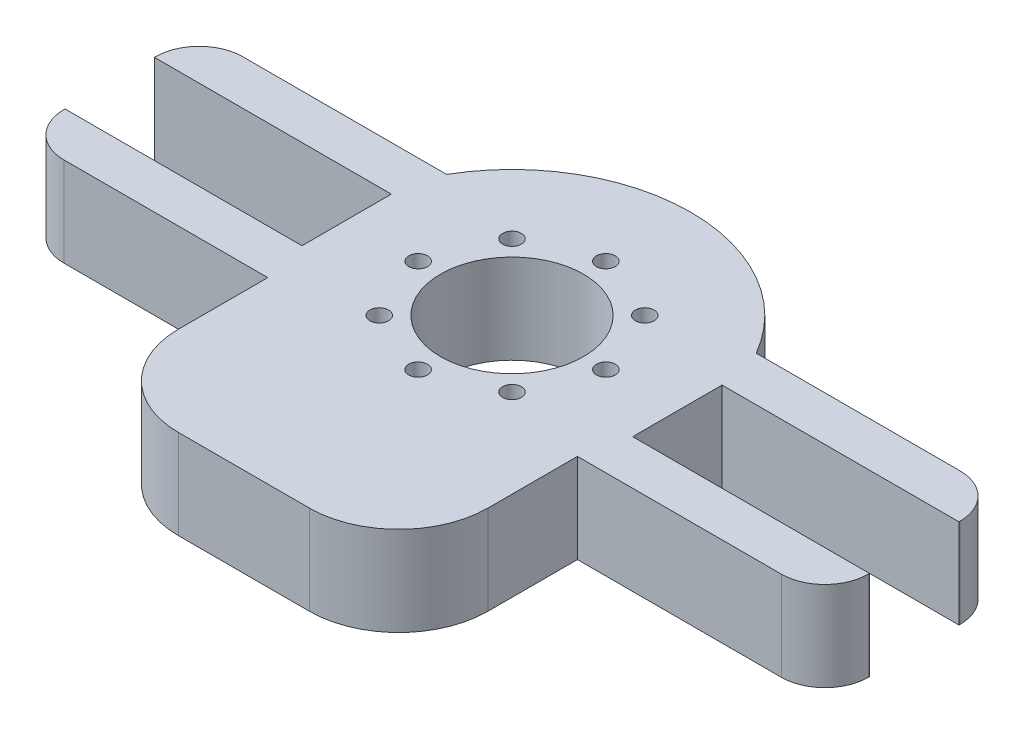
ISO-10303-21;
HEADER;
FILE_DESCRIPTION(('STEP AP214'),'2;1');
FILE_NAME('part.step','',(''),(''),'','','');
FILE_SCHEMA(('AUTOMOTIVE_DESIGN { 1 0 10303 214 1 1 1 1 }'));
ENDSEC;
DATA;
#1=APPLICATION_CONTEXT('core data for automotive mechanical design processes');
#2=APPLICATION_PROTOCOL_DEFINITION('international standard','automotive_design',2000,#1);
#3=PRODUCT_CONTEXT('',#1,'mechanical');
#4=PRODUCT('Part','Part','',(#3));
#5=PRODUCT_RELATED_PRODUCT_CATEGORY('part','',(#4));
#6=PRODUCT_DEFINITION_FORMATION('','',#4);
#7=PRODUCT_DEFINITION_CONTEXT('part definition',#1,'design');
#8=PRODUCT_DEFINITION('design','',#6,#7);
#9=PRODUCT_DEFINITION_SHAPE('','',#8);
#10=(LENGTH_UNIT() NAMED_UNIT(*) SI_UNIT(.MILLI.,.METRE.));
#11=(NAMED_UNIT(*) PLANE_ANGLE_UNIT() SI_UNIT($,.RADIAN.));
#12=(NAMED_UNIT(*) SI_UNIT($,.STERADIAN.) SOLID_ANGLE_UNIT());
#13=UNCERTAINTY_MEASURE_WITH_UNIT(LENGTH_MEASURE(1.E-05),#10,'distance_accuracy_value','');
#14=(GEOMETRIC_REPRESENTATION_CONTEXT(3) GLOBAL_UNCERTAINTY_ASSIGNED_CONTEXT((#13)) GLOBAL_UNIT_ASSIGNED_CONTEXT((#10,
#11,#12)) REPRESENTATION_CONTEXT('',''));
#15=CARTESIAN_POINT('',(0.,0.,0.));
#16=DIRECTION('',(0.,0.,1.));
#17=DIRECTION('',(1.,0.,0.));
#18=AXIS2_PLACEMENT_3D('',#15,#16,#17);
#19=CARTESIAN_POINT('',(-90.,20.,-20.));
#20=DIRECTION('',(-1.,0.,0.));
#21=DIRECTION('',(0.,0.,1.));
#22=AXIS2_PLACEMENT_3D('',#19,#20,#21);
#23=PLANE('',#22);
#24=DIRECTION('',(0.,0.,-1.));
#25=VECTOR('',#24,1.);
#26=CARTESIAN_POINT('',(-90.,20.,-20.));
#27=LINE('',#26,#25);
#28=CARTESIAN_POINT('',(-90.,20.,-10.));
#29=VERTEX_POINT('',#28);
#30=CARTESIAN_POINT('',(-90.,20.,-10.25));
#31=VERTEX_POINT('',#30);
#32=EDGE_CURVE('E236',#29,#31,#27,.T.);
#33=ORIENTED_EDGE('',*,*,#32,.T.);
#34=DIRECTION('',(0.,-1.,0.));
#35=VECTOR('',#34,1.);
#36=CARTESIAN_POINT('',(-90.,20.,-10.25));
#37=LINE('',#36,#35);
#38=CARTESIAN_POINT('',(-90.,0.,-10.25));
#39=VERTEX_POINT('',#38);
#40=EDGE_CURVE('E428',#31,#39,#37,.T.);
#41=ORIENTED_EDGE('',*,*,#40,.T.);
#42=DIRECTION('',(0.,0.,-1.));
#43=VECTOR('',#42,1.);
#44=CARTESIAN_POINT('',(-90.,0.,-20.));
#45=LINE('',#44,#43);
#46=CARTESIAN_POINT('',(-90.,0.,-10.));
#47=VERTEX_POINT('',#46);
#48=EDGE_CURVE('E272',#47,#39,#45,.T.);
#49=ORIENTED_EDGE('',*,*,#48,.F.);
#50=DIRECTION('',(0.,1.,0.));
#51=VECTOR('',#50,1.);
#52=CARTESIAN_POINT('',(-90.,-56.6480361530742,-10.));
#53=LINE('',#52,#51);
#54=EDGE_CURVE('E219',#47,#29,#53,.T.);
#55=ORIENTED_EDGE('',*,*,#54,.T.);
#56=EDGE_LOOP('',(#33,#41,#49,#55));
#57=FACE_BOUND('',#56,.T.);
#58=ADVANCED_FACE('F45',(#57),#23,.T.);
#59=CARTESIAN_POINT('',(-90.,0.,10.25));
#60=VERTEX_POINT('',#59);
#61=CARTESIAN_POINT('',(-90.,0.,10.));
#62=VERTEX_POINT('',#61);
#63=EDGE_CURVE('E274',#60,#62,#45,.T.);
#64=ORIENTED_EDGE('',*,*,#63,.F.);
#65=DIRECTION('',(0.,-1.,0.));
#66=VECTOR('',#65,1.);
#67=CARTESIAN_POINT('',(-90.,20.,10.25));
#68=LINE('',#67,#66);
#69=CARTESIAN_POINT('',(-90.,20.,10.25));
#70=VERTEX_POINT('',#69);
#71=EDGE_CURVE('E419',#60,#70,#68,.F.);
#72=ORIENTED_EDGE('',*,*,#71,.T.);
#73=CARTESIAN_POINT('',(-90.,20.,10.));
#74=VERTEX_POINT('',#73);
#75=EDGE_CURVE('E258',#70,#74,#27,.T.);
#76=ORIENTED_EDGE('',*,*,#75,.T.);
#77=DIRECTION('',(0.,1.,0.));
#78=VECTOR('',#77,1.);
#79=CARTESIAN_POINT('',(-90.,-56.6480361530742,10.));
#80=LINE('',#79,#78);
#81=EDGE_CURVE('E245',#62,#74,#80,.T.);
#82=ORIENTED_EDGE('',*,*,#81,.F.);
#83=EDGE_LOOP('',(#64,#72,#76,#82));
#84=FACE_BOUND('',#83,.T.);
#85=ADVANCED_FACE('F478',(#84),#23,.T.);
#86=CARTESIAN_POINT('',(90.,20.,-20.));
#87=DIRECTION('',(-1.,0.,0.));
#88=DIRECTION('',(0.,0.,1.));
#89=AXIS2_PLACEMENT_3D('',#86,#87,#88);
#90=PLANE('',#89);
#91=DIRECTION('',(0.,0.,-1.));
#92=VECTOR('',#91,1.);
#93=CARTESIAN_POINT('',(90.,0.,-20.));
#94=LINE('',#93,#92);
#95=CARTESIAN_POINT('',(90.,0.,-10.));
#96=VERTEX_POINT('',#95);
#97=CARTESIAN_POINT('',(90.,0.,-10.25));
#98=VERTEX_POINT('',#97);
#99=EDGE_CURVE('E370',#96,#98,#94,.T.);
#100=ORIENTED_EDGE('',*,*,#99,.T.);
#101=DIRECTION('',(0.,-1.,0.));
#102=VECTOR('',#101,1.);
#103=CARTESIAN_POINT('',(90.,20.,-10.25));
#104=LINE('',#103,#102);
#105=CARTESIAN_POINT('',(90.,20.,-10.25));
#106=VERTEX_POINT('',#105);
#107=EDGE_CURVE('E406',#98,#106,#104,.F.);
#108=ORIENTED_EDGE('',*,*,#107,.T.);
#109=DIRECTION('',(0.,0.,-1.));
#110=VECTOR('',#109,1.);
#111=CARTESIAN_POINT('',(90.,20.,-20.));
#112=LINE('',#111,#110);
#113=CARTESIAN_POINT('',(90.,20.,-10.));
#114=VERTEX_POINT('',#113);
#115=EDGE_CURVE('E348',#114,#106,#112,.T.);
#116=ORIENTED_EDGE('',*,*,#115,.F.);
#117=DIRECTION('',(0.,1.,0.));
#118=VECTOR('',#117,1.);
#119=CARTESIAN_POINT('',(90.,-56.6480361530742,-10.));
#120=LINE('',#119,#118);
#121=EDGE_CURVE('E315',#96,#114,#120,.T.);
#122=ORIENTED_EDGE('',*,*,#121,.F.);
#123=EDGE_LOOP('',(#100,#108,#116,#122));
#124=FACE_BOUND('',#123,.T.);
#125=ADVANCED_FACE('F595',(#124),#90,.F.);
#126=CARTESIAN_POINT('',(0.,20.,0.));
#127=DIRECTION('',(0.,-1.,0.));
#128=DIRECTION('',(0.,0.,-1.));
#129=AXIS2_PLACEMENT_3D('',#126,#127,#128);
#130=CYLINDRICAL_SURFACE('',#129,40.);
#131=CARTESIAN_POINT('',(0.,0.,0.));
#132=DIRECTION('',(0.,1.,0.));
#133=DIRECTION('',(0.,0.,1.));
#134=AXIS2_PLACEMENT_3D('',#131,#132,#133);
#135=CIRCLE('',#134,40.);
#136=CARTESIAN_POINT('',(34.6410161513776,0.,-20.));
#137=VERTEX_POINT('',#136);
#138=CARTESIAN_POINT('',(-34.6410161513776,0.,-20.));
#139=VERTEX_POINT('',#138);
#140=EDGE_CURVE('E326',#137,#139,#135,.T.);
#141=ORIENTED_EDGE('',*,*,#140,.T.);
#142=DIRECTION('',(0.,-1.,0.));
#143=VECTOR('',#142,1.);
#144=CARTESIAN_POINT('',(-34.6410161513776,20.,-20.));
#145=LINE('',#144,#143);
#146=CARTESIAN_POINT('',(-34.6410161513776,20.,-20.));
#147=VERTEX_POINT('',#146);
#148=EDGE_CURVE('E286',#147,#139,#145,.T.);
#149=ORIENTED_EDGE('',*,*,#148,.F.);
#150=CARTESIAN_POINT('',(0.,20.,0.));
#151=DIRECTION('',(0.,1.,0.));
#152=DIRECTION('',(0.,0.,1.));
#153=AXIS2_PLACEMENT_3D('',#150,#151,#152);
#154=CIRCLE('',#153,40.);
#155=CARTESIAN_POINT('',(34.6410161513776,20.,-20.));
#156=VERTEX_POINT('',#155);
#157=EDGE_CURVE('E333',#156,#147,#154,.T.);
#158=ORIENTED_EDGE('',*,*,#157,.F.);
#159=DIRECTION('',(0.,-1.,0.));
#160=VECTOR('',#159,1.);
#161=CARTESIAN_POINT('',(34.6410161513776,20.,-20.));
#162=LINE('',#161,#160);
#163=EDGE_CURVE('E355',#156,#137,#162,.T.);
#164=ORIENTED_EDGE('',*,*,#163,.T.);
#165=EDGE_LOOP('',(#141,#149,#158,#164));
#166=FACE_BOUND('',#165,.T.);
#167=ADVANCED_FACE('F641',(#166),#130,.T.);
#168=CARTESIAN_POINT('',(34.6410161513775,20.,60.));
#169=DIRECTION('',(0.,0.,-1.));
#170=DIRECTION('',(-1.,0.,0.));
#171=AXIS2_PLACEMENT_3D('',#168,#169,#170);
#172=PLANE('',#171);
#173=DIRECTION('',(1.,0.,0.));
#174=VECTOR('',#173,1.);
#175=CARTESIAN_POINT('',(34.6410161513775,20.,60.));
#176=LINE('',#175,#174);
#177=CARTESIAN_POINT('',(-14.6410161513775,20.,60.));
#178=VERTEX_POINT('',#177);
#179=CARTESIAN_POINT('',(14.6410161513775,20.,60.));
#180=VERTEX_POINT('',#179);
#181=EDGE_CURVE('E337',#178,#180,#176,.T.);
#182=ORIENTED_EDGE('',*,*,#181,.F.);
#183=DIRECTION('',(0.,-1.,0.));
#184=VECTOR('',#183,1.);
#185=CARTESIAN_POINT('',(-14.6410161513775,0.,60.));
#186=LINE('',#185,#184);
#187=CARTESIAN_POINT('',(-14.6410161513775,0.,60.));
#188=VERTEX_POINT('',#187);
#189=EDGE_CURVE('E438',#178,#188,#186,.T.);
#190=ORIENTED_EDGE('',*,*,#189,.T.);
#191=DIRECTION('',(1.,0.,0.));
#192=VECTOR('',#191,1.);
#193=CARTESIAN_POINT('',(34.6410161513775,0.,60.));
#194=LINE('',#193,#192);
#195=CARTESIAN_POINT('',(14.6410161513775,0.,60.));
#196=VERTEX_POINT('',#195);
#197=EDGE_CURVE('E359',#188,#196,#194,.T.);
#198=ORIENTED_EDGE('',*,*,#197,.T.);
#199=DIRECTION('',(0.,-1.,0.));
#200=VECTOR('',#199,1.);
#201=CARTESIAN_POINT('',(14.6410161513775,20.,60.));
#202=LINE('',#201,#200);
#203=EDGE_CURVE('E435',#196,#180,#202,.F.);
#204=ORIENTED_EDGE('',*,*,#203,.T.);
#205=EDGE_LOOP('',(#182,#190,#198,#204));
#206=FACE_BOUND('',#205,.T.);
#207=ADVANCED_FACE('F458',(#206),#172,.F.);
#208=CARTESIAN_POINT('',(34.6410161513775,20.,20.));
#209=DIRECTION('',(-1.,0.,0.));
#210=DIRECTION('',(0.,0.,1.));
#211=AXIS2_PLACEMENT_3D('',#208,#209,#210);
#212=PLANE('',#211);
#213=DIRECTION('',(0.,0.,-1.));
#214=VECTOR('',#213,1.);
#215=CARTESIAN_POINT('',(34.6410161513775,20.,20.));
#216=LINE('',#215,#214);
#217=CARTESIAN_POINT('',(34.6410161513775,20.,40.));
#218=VERTEX_POINT('',#217);
#219=CARTESIAN_POINT('',(34.6410161513775,20.,20.));
#220=VERTEX_POINT('',#219);
#221=EDGE_CURVE('E341',#218,#220,#216,.T.);
#222=ORIENTED_EDGE('',*,*,#221,.F.);
#223=DIRECTION('',(0.,-1.,0.));
#224=VECTOR('',#223,1.);
#225=CARTESIAN_POINT('',(34.6410161513775,20.,40.));
#226=LINE('',#225,#224);
#227=CARTESIAN_POINT('',(34.6410161513775,0.,40.));
#228=VERTEX_POINT('',#227);
#229=EDGE_CURVE('E11',#218,#228,#226,.T.);
#230=ORIENTED_EDGE('',*,*,#229,.T.);
#231=DIRECTION('',(0.,0.,-1.));
#232=VECTOR('',#231,1.);
#233=CARTESIAN_POINT('',(34.6410161513775,0.,20.));
#234=LINE('',#233,#232);
#235=CARTESIAN_POINT('',(34.6410161513775,0.,20.));
#236=VERTEX_POINT('',#235);
#237=EDGE_CURVE('E363',#228,#236,#234,.T.);
#238=ORIENTED_EDGE('',*,*,#237,.T.);
#239=DIRECTION('',(0.,-1.,0.));
#240=VECTOR('',#239,1.);
#241=CARTESIAN_POINT('',(34.6410161513775,20.,20.));
#242=LINE('',#241,#240);
#243=EDGE_CURVE('E379',#220,#236,#242,.T.);
#244=ORIENTED_EDGE('',*,*,#243,.F.);
#245=EDGE_LOOP('',(#222,#230,#238,#244));
#246=FACE_BOUND('',#245,.T.);
#247=ADVANCED_FACE('F634',(#246),#212,.F.);
#248=CARTESIAN_POINT('',(90.,20.,20.));
#249=DIRECTION('',(0.,0.,-1.));
#250=DIRECTION('',(-1.,0.,0.));
#251=AXIS2_PLACEMENT_3D('',#248,#249,#250);
#252=PLANE('',#251);
#253=DIRECTION('',(1.,0.,0.));
#254=VECTOR('',#253,1.);
#255=CARTESIAN_POINT('',(90.,0.,20.));
#256=LINE('',#255,#254);
#257=CARTESIAN_POINT('',(80.25,0.,20.));
#258=VERTEX_POINT('',#257);
#259=EDGE_CURVE('E366',#236,#258,#256,.T.);
#260=ORIENTED_EDGE('',*,*,#259,.T.);
#261=DIRECTION('',(0.,-1.,0.));
#262=VECTOR('',#261,1.);
#263=CARTESIAN_POINT('',(80.25,20.,20.));
#264=LINE('',#263,#262);
#265=CARTESIAN_POINT('',(80.25,20.,20.));
#266=VERTEX_POINT('',#265);
#267=EDGE_CURVE('E393',#258,#266,#264,.F.);
#268=ORIENTED_EDGE('',*,*,#267,.T.);
#269=DIRECTION('',(1.,0.,0.));
#270=VECTOR('',#269,1.);
#271=CARTESIAN_POINT('',(90.,20.,20.));
#272=LINE('',#271,#270);
#273=EDGE_CURVE('E344',#220,#266,#272,.T.);
#274=ORIENTED_EDGE('',*,*,#273,.F.);
#275=ORIENTED_EDGE('',*,*,#243,.T.);
#276=EDGE_LOOP('',(#260,#268,#274,#275));
#277=FACE_BOUND('',#276,.T.);
#278=ADVANCED_FACE('F630',(#277),#252,.F.);
#279=CARTESIAN_POINT('',(90.,20.,10.25));
#280=VERTEX_POINT('',#279);
#281=CARTESIAN_POINT('',(90.,20.,10.));
#282=VERTEX_POINT('',#281);
#283=EDGE_CURVE('E349',#280,#282,#112,.T.);
#284=ORIENTED_EDGE('',*,*,#283,.F.);
#285=DIRECTION('',(0.,-1.,0.));
#286=VECTOR('',#285,1.);
#287=CARTESIAN_POINT('',(90.,20.,10.25));
#288=LINE('',#287,#286);
#289=CARTESIAN_POINT('',(90.,0.,10.25));
#290=VERTEX_POINT('',#289);
#291=EDGE_CURVE('E383',#280,#290,#288,.T.);
#292=ORIENTED_EDGE('',*,*,#291,.T.);
#293=CARTESIAN_POINT('',(90.,0.,10.));
#294=VERTEX_POINT('',#293);
#295=EDGE_CURVE('E371',#290,#294,#94,.T.);
#296=ORIENTED_EDGE('',*,*,#295,.T.);
#297=DIRECTION('',(0.,1.,0.));
#298=VECTOR('',#297,1.);
#299=CARTESIAN_POINT('',(90.,-56.6480361530742,10.));
#300=LINE('',#299,#298);
#301=EDGE_CURVE('E318',#294,#282,#300,.T.);
#302=ORIENTED_EDGE('',*,*,#301,.T.);
#303=EDGE_LOOP('',(#284,#292,#296,#302));
#304=FACE_BOUND('',#303,.T.);
#305=ADVANCED_FACE('F626',(#304),#90,.F.);
#306=CARTESIAN_POINT('',(34.6410161513776,20.,-20.));
#307=DIRECTION('',(0.,0.,1.));
#308=DIRECTION('',(1.,0.,0.));
#309=AXIS2_PLACEMENT_3D('',#306,#307,#308);
#310=PLANE('',#309);
#311=DIRECTION('',(-1.,0.,0.));
#312=VECTOR('',#311,1.);
#313=CARTESIAN_POINT('',(34.6410161513776,20.,-20.));
#314=LINE('',#313,#312);
#315=CARTESIAN_POINT('',(80.25,20.,-20.));
#316=VERTEX_POINT('',#315);
#317=EDGE_CURVE('E352',#316,#156,#314,.T.);
#318=ORIENTED_EDGE('',*,*,#317,.F.);
#319=DIRECTION('',(0.,-1.,0.));
#320=VECTOR('',#319,1.);
#321=CARTESIAN_POINT('',(80.25,20.,-20.));
#322=LINE('',#321,#320);
#323=CARTESIAN_POINT('',(80.25,0.,-20.));
#324=VERTEX_POINT('',#323);
#325=EDGE_CURVE('E402',#316,#324,#322,.T.);
#326=ORIENTED_EDGE('',*,*,#325,.T.);
#327=DIRECTION('',(-1.,0.,0.));
#328=VECTOR('',#327,1.);
#329=CARTESIAN_POINT('',(34.6410161513776,0.,-20.));
#330=LINE('',#329,#328);
#331=EDGE_CURVE('E338',#324,#137,#330,.T.);
#332=ORIENTED_EDGE('',*,*,#331,.T.);
#333=ORIENTED_EDGE('',*,*,#163,.F.);
#334=EDGE_LOOP('',(#318,#326,#332,#333));
#335=FACE_BOUND('',#334,.T.);
#336=ADVANCED_FACE('F556',(#335),#310,.F.);
#337=CARTESIAN_POINT('',(0.,20.,0.));
#338=DIRECTION('',(0.,1.,0.));
#339=DIRECTION('',(0.,0.,1.));
#340=AXIS2_PLACEMENT_3D('',#337,#338,#339);
#341=PLANE('',#340);
#342=CARTESIAN_POINT('',(21.,20.,0.));
#343=DIRECTION('',(0.,1.,0.));
#344=DIRECTION('',(0.,0.,1.));
#345=AXIS2_PLACEMENT_3D('',#342,#343,#344);
#346=CIRCLE('',#345,2.1);
#347=CARTESIAN_POINT('',(21.,20.,2.1));
#348=VERTEX_POINT('',#347);
#349=EDGE_CURVE('E541',#348,#348,#346,.T.);
#350=ORIENTED_EDGE('',*,*,#349,.F.);
#351=EDGE_LOOP('',(#350));
#352=FACE_BOUND('',#351,.T.);
#353=CARTESIAN_POINT('',(14.8492424049175,20.,14.8492424049175));
#354=DIRECTION('',(0.,1.,0.));
#355=DIRECTION('',(0.,0.,1.));
#356=AXIS2_PLACEMENT_3D('',#353,#354,#355);
#357=CIRCLE('',#356,2.1);
#358=CARTESIAN_POINT('',(14.8492424049175,20.,16.9492424049175));
#359=VERTEX_POINT('',#358);
#360=EDGE_CURVE('E537',#359,#359,#357,.T.);
#361=ORIENTED_EDGE('',*,*,#360,.F.);
#362=EDGE_LOOP('',(#361));
#363=FACE_BOUND('',#362,.T.);
#364=CARTESIAN_POINT('',(0.,20.,21.));
#365=DIRECTION('',(0.,1.,0.));
#366=DIRECTION('',(0.,0.,1.));
#367=AXIS2_PLACEMENT_3D('',#364,#365,#366);
#368=CIRCLE('',#367,2.1);
#369=CARTESIAN_POINT('',(0.,20.,23.1));
#370=VERTEX_POINT('',#369);
#371=EDGE_CURVE('E529',#370,#370,#368,.T.);
#372=ORIENTED_EDGE('',*,*,#371,.F.);
#373=EDGE_LOOP('',(#372));
#374=FACE_BOUND('',#373,.T.);
#375=CARTESIAN_POINT('',(-14.8492424049176,20.,14.8492424049174));
#376=DIRECTION('',(0.,1.,0.));
#377=DIRECTION('',(0.,0.,1.));
#378=AXIS2_PLACEMENT_3D('',#375,#376,#377);
#379=CIRCLE('',#378,2.1);
#380=CARTESIAN_POINT('',(-14.8492424049176,20.,16.9492424049174));
#381=VERTEX_POINT('',#380);
#382=EDGE_CURVE('E521',#381,#381,#379,.T.);
#383=ORIENTED_EDGE('',*,*,#382,.F.);
#384=EDGE_LOOP('',(#383));
#385=FACE_BOUND('',#384,.T.);
#386=CARTESIAN_POINT('',(-21.,20.,-1.46642216231412E-13));
#387=DIRECTION('',(0.,1.,0.));
#388=DIRECTION('',(0.,0.,1.));
#389=AXIS2_PLACEMENT_3D('',#386,#387,#388);
#390=CIRCLE('',#389,2.1);
#391=CARTESIAN_POINT('',(-21.,20.,2.09999999999985));
#392=VERTEX_POINT('',#391);
#393=EDGE_CURVE('E513',#392,#392,#390,.T.);
#394=ORIENTED_EDGE('',*,*,#393,.F.);
#395=EDGE_LOOP('',(#394));
#396=FACE_BOUND('',#395,.T.);
#397=CARTESIAN_POINT('',(-14.8492424049174,20.,-14.8492424049176));
#398=DIRECTION('',(0.,1.,0.));
#399=DIRECTION('',(0.,0.,1.));
#400=AXIS2_PLACEMENT_3D('',#397,#398,#399);
#401=CIRCLE('',#400,2.1);
#402=CARTESIAN_POINT('',(-14.8492424049174,20.,-12.7492424049176));
#403=VERTEX_POINT('',#402);
#404=EDGE_CURVE('E505',#403,#403,#401,.T.);
#405=ORIENTED_EDGE('',*,*,#404,.F.);
#406=EDGE_LOOP('',(#405));
#407=FACE_BOUND('',#406,.T.);
#408=CARTESIAN_POINT('',(2.19963324347117E-13,20.,-21.));
#409=DIRECTION('',(0.,1.,0.));
#410=DIRECTION('',(0.,0.,1.));
#411=AXIS2_PLACEMENT_3D('',#408,#409,#410);
#412=CIRCLE('',#411,2.1);
#413=CARTESIAN_POINT('',(2.19963324347117E-13,20.,-18.9));
#414=VERTEX_POINT('',#413);
#415=EDGE_CURVE('E497',#414,#414,#412,.T.);
#416=ORIENTED_EDGE('',*,*,#415,.F.);
#417=EDGE_LOOP('',(#416));
#418=FACE_BOUND('',#417,.T.);
#419=CARTESIAN_POINT('',(14.8492424049177,20.,-14.8492424049173));
#420=DIRECTION('',(0.,1.,0.));
#421=DIRECTION('',(0.,0.,1.));
#422=AXIS2_PLACEMENT_3D('',#419,#420,#421);
#423=CIRCLE('',#422,2.1);
#424=CARTESIAN_POINT('',(14.8492424049177,20.,-12.7492424049173));
#425=VERTEX_POINT('',#424);
#426=EDGE_CURVE('E488',#425,#425,#423,.T.);
#427=ORIENTED_EDGE('',*,*,#426,.F.);
#428=EDGE_LOOP('',(#427));
#429=FACE_BOUND('',#428,.T.);
#430=DIRECTION('',(0.,0.,-1.));
#431=VECTOR('',#430,1.);
#432=CARTESIAN_POINT('',(-34.6410161513775,20.,20.));
#433=LINE('',#432,#431);
#434=CARTESIAN_POINT('',(-34.6410161513775,20.,40.));
#435=VERTEX_POINT('',#434);
#436=CARTESIAN_POINT('',(-34.6410161513775,20.,20.));
#437=VERTEX_POINT('',#436);
#438=EDGE_CURVE('E265',#435,#437,#433,.T.);
#439=ORIENTED_EDGE('',*,*,#438,.F.);
#440=CARTESIAN_POINT('',(-14.6410161513775,20.,40.));
#441=DIRECTION('',(0.,1.,0.));
#442=DIRECTION('',(0.,0.,1.));
#443=AXIS2_PLACEMENT_3D('',#440,#441,#442);
#444=CIRCLE('',#443,20.);
#445=EDGE_CURVE('E54',#435,#178,#444,.T.);
#446=ORIENTED_EDGE('',*,*,#445,.T.);
#447=ORIENTED_EDGE('',*,*,#181,.T.);
#448=CARTESIAN_POINT('',(14.6410161513775,20.,40.));
#449=DIRECTION('',(0.,1.,0.));
#450=DIRECTION('',(0.,0.,1.));
#451=AXIS2_PLACEMENT_3D('',#448,#449,#450);
#452=CIRCLE('',#451,20.);
#453=EDGE_CURVE('E61',#180,#218,#452,.T.);
#454=ORIENTED_EDGE('',*,*,#453,.T.);
#455=ORIENTED_EDGE('',*,*,#221,.T.);
#456=ORIENTED_EDGE('',*,*,#273,.T.);
#457=CARTESIAN_POINT('',(80.25,20.,10.25));
#458=DIRECTION('',(0.,1.,0.));
#459=DIRECTION('',(0.,0.,1.));
#460=AXIS2_PLACEMENT_3D('',#457,#458,#459);
#461=CIRCLE('',#460,9.75);
#462=EDGE_CURVE('E399',#266,#280,#461,.T.);
#463=ORIENTED_EDGE('',*,*,#462,.T.);
#464=ORIENTED_EDGE('',*,*,#283,.T.);
#465=DIRECTION('',(1.,0.,0.));
#466=VECTOR('',#465,1.);
#467=CARTESIAN_POINT('',(90.,20.,10.));
#468=LINE('',#467,#466);
#469=CARTESIAN_POINT('',(37.,20.,10.));
#470=VERTEX_POINT('',#469);
#471=EDGE_CURVE('E303',#470,#282,#468,.T.);
#472=ORIENTED_EDGE('',*,*,#471,.F.);
#473=DIRECTION('',(0.,0.,1.));
#474=VECTOR('',#473,1.);
#475=CARTESIAN_POINT('',(37.,20.,10.));
#476=LINE('',#475,#474);
#477=CARTESIAN_POINT('',(37.,20.,-10.));
#478=VERTEX_POINT('',#477);
#479=EDGE_CURVE('E299',#478,#470,#476,.T.);
#480=ORIENTED_EDGE('',*,*,#479,.F.);
#481=DIRECTION('',(-1.,0.,0.));
#482=VECTOR('',#481,1.);
#483=CARTESIAN_POINT('',(37.,20.,-10.));
#484=LINE('',#483,#482);
#485=EDGE_CURVE('E308',#114,#478,#484,.T.);
#486=ORIENTED_EDGE('',*,*,#485,.F.);
#487=ORIENTED_EDGE('',*,*,#115,.T.);
#488=CARTESIAN_POINT('',(80.25,20.,-10.25));
#489=DIRECTION('',(0.,1.,0.));
#490=DIRECTION('',(0.,0.,1.));
#491=AXIS2_PLACEMENT_3D('',#488,#489,#490);
#492=CIRCLE('',#491,9.75);
#493=EDGE_CURVE('E396',#106,#316,#492,.T.);
#494=ORIENTED_EDGE('',*,*,#493,.T.);
#495=ORIENTED_EDGE('',*,*,#317,.T.);
#496=ORIENTED_EDGE('',*,*,#157,.T.);
#497=DIRECTION('',(1.,0.,0.));
#498=VECTOR('',#497,1.);
#499=CARTESIAN_POINT('',(-34.6410161513776,20.,-20.));
#500=LINE('',#499,#498);
#501=CARTESIAN_POINT('',(-80.25,20.,-20.));
#502=VERTEX_POINT('',#501);
#503=EDGE_CURVE('E254',#502,#147,#500,.T.);
#504=ORIENTED_EDGE('',*,*,#503,.F.);
#505=CARTESIAN_POINT('',(-80.25,20.,-10.25));
#506=DIRECTION('',(0.,1.,0.));
#507=DIRECTION('',(0.,0.,1.));
#508=AXIS2_PLACEMENT_3D('',#505,#506,#507);
#509=CIRCLE('',#508,9.75);
#510=EDGE_CURVE('E422',#502,#31,#509,.T.);
#511=ORIENTED_EDGE('',*,*,#510,.T.);
#512=ORIENTED_EDGE('',*,*,#32,.F.);
#513=DIRECTION('',(1.,0.,0.));
#514=VECTOR('',#513,1.);
#515=CARTESIAN_POINT('',(-37.,20.,-10.));
#516=LINE('',#515,#514);
#517=CARTESIAN_POINT('',(-37.,20.,-10.));
#518=VERTEX_POINT('',#517);
#519=EDGE_CURVE('E212',#29,#518,#516,.T.);
#520=ORIENTED_EDGE('',*,*,#519,.T.);
#521=DIRECTION('',(0.,0.,1.));
#522=VECTOR('',#521,1.);
#523=CARTESIAN_POINT('',(-37.,20.,10.));
#524=LINE('',#523,#522);
#525=CARTESIAN_POINT('',(-37.,20.,10.));
#526=VERTEX_POINT('',#525);
#527=EDGE_CURVE('E223',#518,#526,#524,.T.);
#528=ORIENTED_EDGE('',*,*,#527,.T.);
#529=DIRECTION('',(-1.,0.,0.));
#530=VECTOR('',#529,1.);
#531=CARTESIAN_POINT('',(-90.,20.,10.));
#532=LINE('',#531,#530);
#533=EDGE_CURVE('E220',#526,#74,#532,.T.);
#534=ORIENTED_EDGE('',*,*,#533,.T.);
#535=ORIENTED_EDGE('',*,*,#75,.F.);
#536=CARTESIAN_POINT('',(-80.25,20.,10.25));
#537=DIRECTION('',(0.,1.,0.));
#538=DIRECTION('',(0.,0.,1.));
#539=AXIS2_PLACEMENT_3D('',#536,#537,#538);
#540=CIRCLE('',#539,9.75);
#541=CARTESIAN_POINT('',(-80.25,20.,20.));
#542=VERTEX_POINT('',#541);
#543=EDGE_CURVE('E425',#70,#542,#540,.T.);
#544=ORIENTED_EDGE('',*,*,#543,.T.);
#545=DIRECTION('',(-1.,0.,0.));
#546=VECTOR('',#545,1.);
#547=CARTESIAN_POINT('',(-90.,20.,20.));
#548=LINE('',#547,#546);
#549=EDGE_CURVE('E261',#437,#542,#548,.T.);
#550=ORIENTED_EDGE('',*,*,#549,.F.);
#551=EDGE_LOOP('',(#439,#446,#447,#454,#455,#456,#463,#464,#472,#480,#486,#487,#494,#495,#496,
#504,#511,#512,#520,#528,#534,#535,#544,#550));
#552=FACE_BOUND('',#551,.T.);
#553=CARTESIAN_POINT('',(0.,20.,0.));
#554=DIRECTION('',(0.,1.,0.));
#555=DIRECTION('',(0.,0.,1.));
#556=AXIS2_PLACEMENT_3D('',#553,#554,#555);
#557=CIRCLE('',#556,16.);
#558=CARTESIAN_POINT('',(0.,20.,16.));
#559=VERTEX_POINT('',#558);
#560=EDGE_CURVE('E304',#559,#559,#557,.T.);
#561=ORIENTED_EDGE('',*,*,#560,.F.);
#562=EDGE_LOOP('',(#561));
#563=FACE_BOUND('',#562,.T.);
#564=ADVANCED_FACE('F233',(#352,#363,#374,#385,#396,#407,#418,#429,#552,#563),#341,.T.);
#565=CARTESIAN_POINT('',(0.,0.,0.));
#566=DIRECTION('',(0.,1.,0.));
#567=DIRECTION('',(0.,0.,1.));
#568=AXIS2_PLACEMENT_3D('',#565,#566,#567);
#569=PLANE('',#568);
#570=CARTESIAN_POINT('',(21.,0.,0.));
#571=DIRECTION('',(0.,1.,0.));
#572=DIRECTION('',(0.,0.,1.));
#573=AXIS2_PLACEMENT_3D('',#570,#571,#572);
#574=CIRCLE('',#573,2.1);
#575=CARTESIAN_POINT('',(21.,0.,2.1));
#576=VERTEX_POINT('',#575);
#577=EDGE_CURVE('E230',#576,#576,#574,.F.);
#578=ORIENTED_EDGE('',*,*,#577,.F.);
#579=EDGE_LOOP('',(#578));
#580=FACE_BOUND('',#579,.T.);
#581=CARTESIAN_POINT('',(14.8492424049175,0.,14.8492424049175));
#582=DIRECTION('',(0.,1.,0.));
#583=DIRECTION('',(0.,0.,1.));
#584=AXIS2_PLACEMENT_3D('',#581,#582,#583);
#585=CIRCLE('',#584,2.1);
#586=CARTESIAN_POINT('',(14.8492424049175,0.,16.9492424049175));
#587=VERTEX_POINT('',#586);
#588=EDGE_CURVE('E533',#587,#587,#585,.F.);
#589=ORIENTED_EDGE('',*,*,#588,.F.);
#590=EDGE_LOOP('',(#589));
#591=FACE_BOUND('',#590,.T.);
#592=CARTESIAN_POINT('',(0.,0.,21.));
#593=DIRECTION('',(0.,1.,0.));
#594=DIRECTION('',(0.,0.,1.));
#595=AXIS2_PLACEMENT_3D('',#592,#593,#594);
#596=CIRCLE('',#595,2.1);
#597=CARTESIAN_POINT('',(0.,0.,23.1));
#598=VERTEX_POINT('',#597);
#599=EDGE_CURVE('E525',#598,#598,#596,.F.);
#600=ORIENTED_EDGE('',*,*,#599,.F.);
#601=EDGE_LOOP('',(#600));
#602=FACE_BOUND('',#601,.T.);
#603=CARTESIAN_POINT('',(-14.8492424049176,0.,14.8492424049174));
#604=DIRECTION('',(0.,1.,0.));
#605=DIRECTION('',(0.,0.,1.));
#606=AXIS2_PLACEMENT_3D('',#603,#604,#605);
#607=CIRCLE('',#606,2.1);
#608=CARTESIAN_POINT('',(-14.8492424049176,0.,16.9492424049174));
#609=VERTEX_POINT('',#608);
#610=EDGE_CURVE('E517',#609,#609,#607,.F.);
#611=ORIENTED_EDGE('',*,*,#610,.F.);
#612=EDGE_LOOP('',(#611));
#613=FACE_BOUND('',#612,.T.);
#614=CARTESIAN_POINT('',(-21.,0.,-1.46642216231412E-13));
#615=DIRECTION('',(0.,1.,0.));
#616=DIRECTION('',(0.,0.,1.));
#617=AXIS2_PLACEMENT_3D('',#614,#615,#616);
#618=CIRCLE('',#617,2.1);
#619=CARTESIAN_POINT('',(-21.,0.,2.09999999999985));
#620=VERTEX_POINT('',#619);
#621=EDGE_CURVE('E509',#620,#620,#618,.F.);
#622=ORIENTED_EDGE('',*,*,#621,.F.);
#623=EDGE_LOOP('',(#622));
#624=FACE_BOUND('',#623,.T.);
#625=CARTESIAN_POINT('',(-14.8492424049174,0.,-14.8492424049176));
#626=DIRECTION('',(0.,1.,0.));
#627=DIRECTION('',(0.,0.,1.));
#628=AXIS2_PLACEMENT_3D('',#625,#626,#627);
#629=CIRCLE('',#628,2.1);
#630=CARTESIAN_POINT('',(-14.8492424049174,0.,-12.7492424049176));
#631=VERTEX_POINT('',#630);
#632=EDGE_CURVE('E501',#631,#631,#629,.F.);
#633=ORIENTED_EDGE('',*,*,#632,.F.);
#634=EDGE_LOOP('',(#633));
#635=FACE_BOUND('',#634,.T.);
#636=CARTESIAN_POINT('',(2.19963324347117E-13,0.,-21.));
#637=DIRECTION('',(0.,1.,0.));
#638=DIRECTION('',(0.,0.,1.));
#639=AXIS2_PLACEMENT_3D('',#636,#637,#638);
#640=CIRCLE('',#639,2.1);
#641=CARTESIAN_POINT('',(2.19963324347117E-13,0.,-18.9));
#642=VERTEX_POINT('',#641);
#643=EDGE_CURVE('E492',#642,#642,#640,.F.);
#644=ORIENTED_EDGE('',*,*,#643,.F.);
#645=EDGE_LOOP('',(#644));
#646=FACE_BOUND('',#645,.T.);
#647=CARTESIAN_POINT('',(14.8492424049177,0.,-14.8492424049173));
#648=DIRECTION('',(0.,1.,0.));
#649=DIRECTION('',(0.,0.,1.));
#650=AXIS2_PLACEMENT_3D('',#647,#648,#649);
#651=CIRCLE('',#650,2.1);
#652=CARTESIAN_POINT('',(14.8492424049177,0.,-12.7492424049173));
#653=VERTEX_POINT('',#652);
#654=EDGE_CURVE('E493',#653,#653,#651,.F.);
#655=ORIENTED_EDGE('',*,*,#654,.F.);
#656=EDGE_LOOP('',(#655));
#657=FACE_BOUND('',#656,.T.);
#658=ORIENTED_EDGE('',*,*,#197,.F.);
#659=CARTESIAN_POINT('',(-14.6410161513775,0.,40.));
#660=DIRECTION('',(0.,1.,0.));
#661=DIRECTION('',(0.,0.,1.));
#662=AXIS2_PLACEMENT_3D('',#659,#660,#661);
#663=CIRCLE('',#662,20.);
#664=CARTESIAN_POINT('',(-34.6410161513775,0.,40.));
#665=VERTEX_POINT('',#664);
#666=EDGE_CURVE('E445',#188,#665,#663,.F.);
#667=ORIENTED_EDGE('',*,*,#666,.T.);
#668=DIRECTION('',(0.,0.,-1.));
#669=VECTOR('',#668,1.);
#670=CARTESIAN_POINT('',(-34.6410161513775,0.,20.));
#671=LINE('',#670,#669);
#672=CARTESIAN_POINT('',(-34.6410161513775,0.,20.));
#673=VERTEX_POINT('',#672);
#674=EDGE_CURVE('E257',#665,#673,#671,.T.);
#675=ORIENTED_EDGE('',*,*,#674,.T.);
#676=DIRECTION('',(-1.,0.,0.));
#677=VECTOR('',#676,1.);
#678=CARTESIAN_POINT('',(-90.,0.,20.));
#679=LINE('',#678,#677);
#680=CARTESIAN_POINT('',(-80.25,0.,20.));
#681=VERTEX_POINT('',#680);
#682=EDGE_CURVE('E277',#673,#681,#679,.T.);
#683=ORIENTED_EDGE('',*,*,#682,.T.);
#684=CARTESIAN_POINT('',(-80.25,0.,10.25));
#685=DIRECTION('',(0.,1.,0.));
#686=DIRECTION('',(0.,0.,1.));
#687=AXIS2_PLACEMENT_3D('',#684,#685,#686);
#688=CIRCLE('',#687,9.75);
#689=EDGE_CURVE('E416',#681,#60,#688,.F.);
#690=ORIENTED_EDGE('',*,*,#689,.T.);
#691=ORIENTED_EDGE('',*,*,#63,.T.);
#692=DIRECTION('',(1.,0.,0.));
#693=VECTOR('',#692,1.);
#694=CARTESIAN_POINT('',(-90.,0.,10.));
#695=LINE('',#694,#693);
#696=CARTESIAN_POINT('',(-37.,0.,10.));
#697=VERTEX_POINT('',#696);
#698=EDGE_CURVE('E253',#62,#697,#695,.T.);
#699=ORIENTED_EDGE('',*,*,#698,.T.);
#700=DIRECTION('',(0.,0.,-1.));
#701=VECTOR('',#700,1.);
#702=CARTESIAN_POINT('',(-37.,0.,10.));
#703=LINE('',#702,#701);
#704=CARTESIAN_POINT('',(-37.,0.,-10.));
#705=VERTEX_POINT('',#704);
#706=EDGE_CURVE('E273',#697,#705,#703,.T.);
#707=ORIENTED_EDGE('',*,*,#706,.T.);
#708=DIRECTION('',(-1.,0.,0.));
#709=VECTOR('',#708,1.);
#710=CARTESIAN_POINT('',(-37.,0.,-10.));
#711=LINE('',#710,#709);
#712=EDGE_CURVE('E215',#705,#47,#711,.T.);
#713=ORIENTED_EDGE('',*,*,#712,.T.);
#714=ORIENTED_EDGE('',*,*,#48,.T.);
#715=CARTESIAN_POINT('',(-80.25,0.,-10.25));
#716=DIRECTION('',(0.,1.,0.));
#717=DIRECTION('',(0.,0.,1.));
#718=AXIS2_PLACEMENT_3D('',#715,#716,#717);
#719=CIRCLE('',#718,9.75);
#720=CARTESIAN_POINT('',(-80.25,0.,-20.));
#721=VERTEX_POINT('',#720);
#722=EDGE_CURVE('E413',#39,#721,#719,.F.);
#723=ORIENTED_EDGE('',*,*,#722,.T.);
#724=DIRECTION('',(1.,0.,0.));
#725=VECTOR('',#724,1.);
#726=CARTESIAN_POINT('',(-34.6410161513776,0.,-20.));
#727=LINE('',#726,#725);
#728=EDGE_CURVE('E269',#721,#139,#727,.T.);
#729=ORIENTED_EDGE('',*,*,#728,.T.);
#730=ORIENTED_EDGE('',*,*,#140,.F.);
#731=ORIENTED_EDGE('',*,*,#331,.F.);
#732=CARTESIAN_POINT('',(80.25,0.,-10.25));
#733=DIRECTION('',(0.,1.,0.));
#734=DIRECTION('',(0.,0.,1.));
#735=AXIS2_PLACEMENT_3D('',#732,#733,#734);
#736=CIRCLE('',#735,9.75);
#737=EDGE_CURVE('E387',#324,#98,#736,.F.);
#738=ORIENTED_EDGE('',*,*,#737,.T.);
#739=ORIENTED_EDGE('',*,*,#99,.F.);
#740=DIRECTION('',(1.,0.,0.));
#741=VECTOR('',#740,1.);
#742=CARTESIAN_POINT('',(37.,0.,-10.));
#743=LINE('',#742,#741);
#744=CARTESIAN_POINT('',(37.,0.,-10.));
#745=VERTEX_POINT('',#744);
#746=EDGE_CURVE('E291',#745,#96,#743,.T.);
#747=ORIENTED_EDGE('',*,*,#746,.F.);
#748=DIRECTION('',(0.,0.,-1.));
#749=VECTOR('',#748,1.);
#750=CARTESIAN_POINT('',(37.,0.,10.));
#751=LINE('',#750,#749);
#752=CARTESIAN_POINT('',(37.,0.,10.));
#753=VERTEX_POINT('',#752);
#754=EDGE_CURVE('E294',#753,#745,#751,.T.);
#755=ORIENTED_EDGE('',*,*,#754,.F.);
#756=DIRECTION('',(-1.,0.,0.));
#757=VECTOR('',#756,1.);
#758=CARTESIAN_POINT('',(90.,0.,10.));
#759=LINE('',#758,#757);
#760=EDGE_CURVE('E298',#294,#753,#759,.T.);
#761=ORIENTED_EDGE('',*,*,#760,.F.);
#762=ORIENTED_EDGE('',*,*,#295,.F.);
#763=CARTESIAN_POINT('',(80.25,0.,10.25));
#764=DIRECTION('',(0.,1.,0.));
#765=DIRECTION('',(0.,0.,1.));
#766=AXIS2_PLACEMENT_3D('',#763,#764,#765);
#767=CIRCLE('',#766,9.75);
#768=EDGE_CURVE('E390',#290,#258,#767,.F.);
#769=ORIENTED_EDGE('',*,*,#768,.T.);
#770=ORIENTED_EDGE('',*,*,#259,.F.);
#771=ORIENTED_EDGE('',*,*,#237,.F.);
#772=CARTESIAN_POINT('',(14.6410161513775,0.,40.));
#773=DIRECTION('',(0.,1.,0.));
#774=DIRECTION('',(0.,0.,1.));
#775=AXIS2_PLACEMENT_3D('',#772,#773,#774);
#776=CIRCLE('',#775,20.);
#777=EDGE_CURVE('E442',#228,#196,#776,.F.);
#778=ORIENTED_EDGE('',*,*,#777,.T.);
#779=EDGE_LOOP('',(#658,#667,#675,#683,#690,#691,#699,#707,#713,#714,#723,#729,#730,#731,#738,
#739,#747,#755,#761,#762,#769,#770,#771,#778));
#780=FACE_BOUND('',#779,.T.);
#781=CARTESIAN_POINT('',(0.,0.,0.));
#782=DIRECTION('',(0.,1.,0.));
#783=DIRECTION('',(0.,0.,1.));
#784=AXIS2_PLACEMENT_3D('',#781,#782,#783);
#785=CIRCLE('',#784,16.);
#786=CARTESIAN_POINT('',(0.,0.,16.));
#787=VERTEX_POINT('',#786);
#788=EDGE_CURVE('E290',#787,#787,#785,.F.);
#789=ORIENTED_EDGE('',*,*,#788,.F.);
#790=EDGE_LOOP('',(#789));
#791=FACE_BOUND('',#790,.T.);
#792=ADVANCED_FACE('F463',(#580,#591,#602,#613,#624,#635,#646,#657,#780,#791),#569,.F.);
#793=CARTESIAN_POINT('',(0.,-56.6480361530742,0.));
#794=DIRECTION('',(0.,1.,0.));
#795=DIRECTION('',(0.,0.,1.));
#796=AXIS2_PLACEMENT_3D('',#793,#794,#795);
#797=CYLINDRICAL_SURFACE('',#796,16.);
#798=ORIENTED_EDGE('',*,*,#560,.T.);
#799=EDGE_LOOP('',(#798));
#800=FACE_BOUND('',#799,.T.);
#801=ORIENTED_EDGE('',*,*,#788,.T.);
#802=EDGE_LOOP('',(#801));
#803=FACE_BOUND('',#802,.T.);
#804=ADVANCED_FACE('F616',(#800,#803),#797,.F.);
#805=CARTESIAN_POINT('',(37.,-56.6480361530742,10.));
#806=DIRECTION('',(-1.,0.,0.));
#807=DIRECTION('',(0.,0.,1.));
#808=AXIS2_PLACEMENT_3D('',#805,#806,#807);
#809=PLANE('',#808);
#810=ORIENTED_EDGE('',*,*,#754,.T.);
#811=DIRECTION('',(0.,1.,0.));
#812=VECTOR('',#811,1.);
#813=CARTESIAN_POINT('',(37.,-56.6480361530742,-10.));
#814=LINE('',#813,#812);
#815=EDGE_CURVE('E295',#745,#478,#814,.T.);
#816=ORIENTED_EDGE('',*,*,#815,.T.);
#817=ORIENTED_EDGE('',*,*,#479,.T.);
#818=DIRECTION('',(0.,1.,0.));
#819=VECTOR('',#818,1.);
#820=CARTESIAN_POINT('',(37.,-56.6480361530742,10.));
#821=LINE('',#820,#819);
#822=EDGE_CURVE('E312',#753,#470,#821,.T.);
#823=ORIENTED_EDGE('',*,*,#822,.F.);
#824=EDGE_LOOP('',(#810,#816,#817,#823));
#825=FACE_BOUND('',#824,.T.);
#826=ADVANCED_FACE('F608',(#825),#809,.F.);
#827=CARTESIAN_POINT('',(37.,-56.6480361530742,-10.));
#828=DIRECTION('',(0.,0.,-1.));
#829=DIRECTION('',(-1.,0.,0.));
#830=AXIS2_PLACEMENT_3D('',#827,#828,#829);
#831=PLANE('',#830);
#832=ORIENTED_EDGE('',*,*,#746,.T.);
#833=ORIENTED_EDGE('',*,*,#121,.T.);
#834=ORIENTED_EDGE('',*,*,#485,.T.);
#835=ORIENTED_EDGE('',*,*,#815,.F.);
#836=EDGE_LOOP('',(#832,#833,#834,#835));
#837=FACE_BOUND('',#836,.T.);
#838=ADVANCED_FACE('F604',(#837),#831,.F.);
#839=CARTESIAN_POINT('',(90.,-56.6480361530742,10.));
#840=DIRECTION('',(0.,0.,1.));
#841=DIRECTION('',(1.,0.,0.));
#842=AXIS2_PLACEMENT_3D('',#839,#840,#841);
#843=PLANE('',#842);
#844=ORIENTED_EDGE('',*,*,#760,.T.);
#845=ORIENTED_EDGE('',*,*,#822,.T.);
#846=ORIENTED_EDGE('',*,*,#471,.T.);
#847=ORIENTED_EDGE('',*,*,#301,.F.);
#848=EDGE_LOOP('',(#844,#845,#846,#847));
#849=FACE_BOUND('',#848,.T.);
#850=ADVANCED_FACE('F607',(#849),#843,.F.);
#851=CARTESIAN_POINT('',(80.25,20.,10.25));
#852=DIRECTION('',(0.,-1.,0.));
#853=DIRECTION('',(0.,0.,-1.));
#854=AXIS2_PLACEMENT_3D('',#851,#852,#853);
#855=CYLINDRICAL_SURFACE('',#854,9.75);
#856=ORIENTED_EDGE('',*,*,#462,.F.);
#857=ORIENTED_EDGE('',*,*,#267,.F.);
#858=ORIENTED_EDGE('',*,*,#768,.F.);
#859=ORIENTED_EDGE('',*,*,#291,.F.);
#860=EDGE_LOOP('',(#856,#857,#858,#859));
#861=FACE_BOUND('',#860,.T.);
#862=ADVANCED_FACE('F612',(#861),#855,.T.);
#863=CARTESIAN_POINT('',(80.25,20.,-10.25));
#864=DIRECTION('',(0.,-1.,0.));
#865=DIRECTION('',(0.,0.,-1.));
#866=AXIS2_PLACEMENT_3D('',#863,#864,#865);
#867=CYLINDRICAL_SURFACE('',#866,9.75);
#868=ORIENTED_EDGE('',*,*,#493,.F.);
#869=ORIENTED_EDGE('',*,*,#107,.F.);
#870=ORIENTED_EDGE('',*,*,#737,.F.);
#871=ORIENTED_EDGE('',*,*,#325,.F.);
#872=EDGE_LOOP('',(#868,#869,#870,#871));
#873=FACE_BOUND('',#872,.T.);
#874=ADVANCED_FACE('F602',(#873),#867,.T.);
#875=CARTESIAN_POINT('',(-34.6410161513776,20.,-20.));
#876=DIRECTION('',(0.,0.,-1.));
#877=DIRECTION('',(-1.,0.,0.));
#878=AXIS2_PLACEMENT_3D('',#875,#876,#877);
#879=PLANE('',#878);
#880=ORIENTED_EDGE('',*,*,#728,.F.);
#881=DIRECTION('',(0.,-1.,0.));
#882=VECTOR('',#881,1.);
#883=CARTESIAN_POINT('',(-80.25,20.,-20.));
#884=LINE('',#883,#882);
#885=EDGE_CURVE('E432',#721,#502,#884,.F.);
#886=ORIENTED_EDGE('',*,*,#885,.T.);
#887=ORIENTED_EDGE('',*,*,#503,.T.);
#888=ORIENTED_EDGE('',*,*,#148,.T.);
#889=EDGE_LOOP('',(#880,#886,#887,#888));
#890=FACE_BOUND('',#889,.T.);
#891=ADVANCED_FACE('F599',(#890),#879,.T.);
#892=CARTESIAN_POINT('',(-90.,20.,20.));
#893=DIRECTION('',(0.,0.,1.));
#894=DIRECTION('',(1.,0.,0.));
#895=AXIS2_PLACEMENT_3D('',#892,#893,#894);
#896=PLANE('',#895);
#897=ORIENTED_EDGE('',*,*,#549,.T.);
#898=DIRECTION('',(0.,-1.,0.));
#899=VECTOR('',#898,1.);
#900=CARTESIAN_POINT('',(-80.25,20.,20.));
#901=LINE('',#900,#899);
#902=EDGE_CURVE('E409',#542,#681,#901,.T.);
#903=ORIENTED_EDGE('',*,*,#902,.T.);
#904=ORIENTED_EDGE('',*,*,#682,.F.);
#905=DIRECTION('',(0.,-1.,0.));
#906=VECTOR('',#905,1.);
#907=CARTESIAN_POINT('',(-34.6410161513775,20.,20.));
#908=LINE('',#907,#906);
#909=EDGE_CURVE('E268',#437,#673,#908,.T.);
#910=ORIENTED_EDGE('',*,*,#909,.F.);
#911=EDGE_LOOP('',(#897,#903,#904,#910));
#912=FACE_BOUND('',#911,.T.);
#913=ADVANCED_FACE('F469',(#912),#896,.T.);
#914=CARTESIAN_POINT('',(-34.6410161513775,20.,20.));
#915=DIRECTION('',(-1.,0.,0.));
#916=DIRECTION('',(0.,0.,1.));
#917=AXIS2_PLACEMENT_3D('',#914,#915,#916);
#918=PLANE('',#917);
#919=ORIENTED_EDGE('',*,*,#674,.F.);
#920=DIRECTION('',(0.,-1.,0.));
#921=VECTOR('',#920,1.);
#922=CARTESIAN_POINT('',(-34.6410161513775,20.,40.));
#923=LINE('',#922,#921);
#924=EDGE_CURVE('E69',#665,#435,#923,.F.);
#925=ORIENTED_EDGE('',*,*,#924,.T.);
#926=ORIENTED_EDGE('',*,*,#438,.T.);
#927=ORIENTED_EDGE('',*,*,#909,.T.);
#928=EDGE_LOOP('',(#919,#925,#926,#927));
#929=FACE_BOUND('',#928,.T.);
#930=ADVANCED_FACE('F465',(#929),#918,.T.);
#931=CARTESIAN_POINT('',(-37.,-56.6480361530742,-10.));
#932=DIRECTION('',(0.,0.,1.));
#933=DIRECTION('',(1.,0.,0.));
#934=AXIS2_PLACEMENT_3D('',#931,#932,#933);
#935=PLANE('',#934);
#936=DIRECTION('',(0.,1.,0.));
#937=VECTOR('',#936,1.);
#938=CARTESIAN_POINT('',(-37.,-56.6480361530742,-10.));
#939=LINE('',#938,#937);
#940=EDGE_CURVE('E208',#705,#518,#939,.T.);
#941=ORIENTED_EDGE('',*,*,#940,.T.);
#942=ORIENTED_EDGE('',*,*,#519,.F.);
#943=ORIENTED_EDGE('',*,*,#54,.F.);
#944=ORIENTED_EDGE('',*,*,#712,.F.);
#945=EDGE_LOOP('',(#941,#942,#943,#944));
#946=FACE_BOUND('',#945,.T.);
#947=ADVANCED_FACE('F210',(#946),#935,.T.);
#948=CARTESIAN_POINT('',(-90.,-56.6480361530742,10.));
#949=DIRECTION('',(0.,0.,-1.));
#950=DIRECTION('',(-1.,0.,0.));
#951=AXIS2_PLACEMENT_3D('',#948,#949,#950);
#952=PLANE('',#951);
#953=ORIENTED_EDGE('',*,*,#81,.T.);
#954=ORIENTED_EDGE('',*,*,#533,.F.);
#955=DIRECTION('',(0.,1.,0.));
#956=VECTOR('',#955,1.);
#957=CARTESIAN_POINT('',(-37.,-56.6480361530742,10.));
#958=LINE('',#957,#956);
#959=EDGE_CURVE('E226',#697,#526,#958,.T.);
#960=ORIENTED_EDGE('',*,*,#959,.F.);
#961=ORIENTED_EDGE('',*,*,#698,.F.);
#962=EDGE_LOOP('',(#953,#954,#960,#961));
#963=FACE_BOUND('',#962,.T.);
#964=ADVANCED_FACE('F483',(#963),#952,.T.);
#965=CARTESIAN_POINT('',(-37.,-56.6480361530742,10.));
#966=DIRECTION('',(-1.,0.,0.));
#967=DIRECTION('',(0.,0.,1.));
#968=AXIS2_PLACEMENT_3D('',#965,#966,#967);
#969=PLANE('',#968);
#970=ORIENTED_EDGE('',*,*,#959,.T.);
#971=ORIENTED_EDGE('',*,*,#527,.F.);
#972=ORIENTED_EDGE('',*,*,#940,.F.);
#973=ORIENTED_EDGE('',*,*,#706,.F.);
#974=EDGE_LOOP('',(#970,#971,#972,#973));
#975=FACE_BOUND('',#974,.T.);
#976=ADVANCED_FACE('F224',(#975),#969,.T.);
#977=CARTESIAN_POINT('',(-80.25,20.,10.25));
#978=DIRECTION('',(0.,-1.,0.));
#979=DIRECTION('',(0.,0.,-1.));
#980=AXIS2_PLACEMENT_3D('',#977,#978,#979);
#981=CYLINDRICAL_SURFACE('',#980,9.75);
#982=ORIENTED_EDGE('',*,*,#543,.F.);
#983=ORIENTED_EDGE('',*,*,#71,.F.);
#984=ORIENTED_EDGE('',*,*,#689,.F.);
#985=ORIENTED_EDGE('',*,*,#902,.F.);
#986=EDGE_LOOP('',(#982,#983,#984,#985));
#987=FACE_BOUND('',#986,.T.);
#988=ADVANCED_FACE('F481',(#987),#981,.T.);
#989=CARTESIAN_POINT('',(-80.25,20.,-10.25));
#990=DIRECTION('',(0.,-1.,0.));
#991=DIRECTION('',(0.,0.,-1.));
#992=AXIS2_PLACEMENT_3D('',#989,#990,#991);
#993=CYLINDRICAL_SURFACE('',#992,9.75);
#994=ORIENTED_EDGE('',*,*,#510,.F.);
#995=ORIENTED_EDGE('',*,*,#885,.F.);
#996=ORIENTED_EDGE('',*,*,#722,.F.);
#997=ORIENTED_EDGE('',*,*,#40,.F.);
#998=EDGE_LOOP('',(#994,#995,#996,#997));
#999=FACE_BOUND('',#998,.T.);
#1000=ADVANCED_FACE('F575',(#999),#993,.T.);
#1001=CARTESIAN_POINT('',(14.8492424049177,-5.93969696196701,-14.8492424049173));
#1002=DIRECTION('',(0.,1.,0.));
#1003=DIRECTION('',(0.,0.,1.));
#1004=AXIS2_PLACEMENT_3D('',#1001,#1002,#1003);
#1005=CYLINDRICAL_SURFACE('',#1004,2.1);
#1006=ORIENTED_EDGE('',*,*,#654,.T.);
#1007=EDGE_LOOP('',(#1006));
#1008=FACE_BOUND('',#1007,.T.);
#1009=ORIENTED_EDGE('',*,*,#426,.T.);
#1010=EDGE_LOOP('',(#1009));
#1011=FACE_BOUND('',#1010,.T.);
#1012=ADVANCED_FACE('F572',(#1008,#1011),#1005,.F.);
#1013=CARTESIAN_POINT('',(2.19963324347117E-13,-5.93969696196701,-21.));
#1014=DIRECTION('',(0.,1.,0.));
#1015=DIRECTION('',(0.,0.,1.));
#1016=AXIS2_PLACEMENT_3D('',#1013,#1014,#1015);
#1017=CYLINDRICAL_SURFACE('',#1016,2.1);
#1018=ORIENTED_EDGE('',*,*,#643,.T.);
#1019=EDGE_LOOP('',(#1018));
#1020=FACE_BOUND('',#1019,.T.);
#1021=ORIENTED_EDGE('',*,*,#415,.T.);
#1022=EDGE_LOOP('',(#1021));
#1023=FACE_BOUND('',#1022,.T.);
#1024=ADVANCED_FACE('F574',(#1020,#1023),#1017,.F.);
#1025=CARTESIAN_POINT('',(-14.8492424049174,-5.93969696196701,-14.8492424049176));
#1026=DIRECTION('',(0.,1.,0.));
#1027=DIRECTION('',(0.,0.,1.));
#1028=AXIS2_PLACEMENT_3D('',#1025,#1026,#1027);
#1029=CYLINDRICAL_SURFACE('',#1028,2.1);
#1030=ORIENTED_EDGE('',*,*,#632,.T.);
#1031=EDGE_LOOP('',(#1030));
#1032=FACE_BOUND('',#1031,.T.);
#1033=ORIENTED_EDGE('',*,*,#404,.T.);
#1034=EDGE_LOOP('',(#1033));
#1035=FACE_BOUND('',#1034,.T.);
#1036=ADVANCED_FACE('F582',(#1032,#1035),#1029,.F.);
#1037=CARTESIAN_POINT('',(-21.,-5.93969696196701,-1.46642216231412E-13));
#1038=DIRECTION('',(0.,1.,0.));
#1039=DIRECTION('',(0.,0.,1.));
#1040=AXIS2_PLACEMENT_3D('',#1037,#1038,#1039);
#1041=CYLINDRICAL_SURFACE('',#1040,2.1);
#1042=ORIENTED_EDGE('',*,*,#621,.T.);
#1043=EDGE_LOOP('',(#1042));
#1044=FACE_BOUND('',#1043,.T.);
#1045=ORIENTED_EDGE('',*,*,#393,.T.);
#1046=EDGE_LOOP('',(#1045));
#1047=FACE_BOUND('',#1046,.T.);
#1048=ADVANCED_FACE('F674',(#1044,#1047),#1041,.F.);
#1049=CARTESIAN_POINT('',(-14.8492424049176,-5.93969696196701,14.8492424049174));
#1050=DIRECTION('',(0.,1.,0.));
#1051=DIRECTION('',(0.,0.,1.));
#1052=AXIS2_PLACEMENT_3D('',#1049,#1050,#1051);
#1053=CYLINDRICAL_SURFACE('',#1052,2.1);
#1054=ORIENTED_EDGE('',*,*,#610,.T.);
#1055=EDGE_LOOP('',(#1054));
#1056=FACE_BOUND('',#1055,.T.);
#1057=ORIENTED_EDGE('',*,*,#382,.T.);
#1058=EDGE_LOOP('',(#1057));
#1059=FACE_BOUND('',#1058,.T.);
#1060=ADVANCED_FACE('F670',(#1056,#1059),#1053,.F.);
#1061=CARTESIAN_POINT('',(0.,-5.93969696196701,21.));
#1062=DIRECTION('',(0.,1.,0.));
#1063=DIRECTION('',(0.,0.,1.));
#1064=AXIS2_PLACEMENT_3D('',#1061,#1062,#1063);
#1065=CYLINDRICAL_SURFACE('',#1064,2.1);
#1066=ORIENTED_EDGE('',*,*,#599,.T.);
#1067=EDGE_LOOP('',(#1066));
#1068=FACE_BOUND('',#1067,.T.);
#1069=ORIENTED_EDGE('',*,*,#371,.T.);
#1070=EDGE_LOOP('',(#1069));
#1071=FACE_BOUND('',#1070,.T.);
#1072=ADVANCED_FACE('F664',(#1068,#1071),#1065,.F.);
#1073=CARTESIAN_POINT('',(14.8492424049175,-5.93969696196701,14.8492424049175));
#1074=DIRECTION('',(0.,1.,0.));
#1075=DIRECTION('',(0.,0.,1.));
#1076=AXIS2_PLACEMENT_3D('',#1073,#1074,#1075);
#1077=CYLINDRICAL_SURFACE('',#1076,2.1);
#1078=ORIENTED_EDGE('',*,*,#588,.T.);
#1079=EDGE_LOOP('',(#1078));
#1080=FACE_BOUND('',#1079,.T.);
#1081=ORIENTED_EDGE('',*,*,#360,.T.);
#1082=EDGE_LOOP('',(#1081));
#1083=FACE_BOUND('',#1082,.T.);
#1084=ADVANCED_FACE('F658',(#1080,#1083),#1077,.F.);
#1085=CARTESIAN_POINT('',(21.,-5.93969696196701,0.));
#1086=DIRECTION('',(0.,1.,0.));
#1087=DIRECTION('',(0.,0.,1.));
#1088=AXIS2_PLACEMENT_3D('',#1085,#1086,#1087);
#1089=CYLINDRICAL_SURFACE('',#1088,2.1);
#1090=ORIENTED_EDGE('',*,*,#577,.T.);
#1091=EDGE_LOOP('',(#1090));
#1092=FACE_BOUND('',#1091,.T.);
#1093=ORIENTED_EDGE('',*,*,#349,.T.);
#1094=EDGE_LOOP('',(#1093));
#1095=FACE_BOUND('',#1094,.T.);
#1096=ADVANCED_FACE('F552',(#1092,#1095),#1089,.F.);
#1097=CARTESIAN_POINT('',(-14.6410161513775,20.,40.));
#1098=DIRECTION('',(0.,1.,0.));
#1099=DIRECTION('',(0.,0.,1.));
#1100=AXIS2_PLACEMENT_3D('',#1097,#1098,#1099);
#1101=CYLINDRICAL_SURFACE('',#1100,20.);
#1102=ORIENTED_EDGE('',*,*,#445,.F.);
#1103=ORIENTED_EDGE('',*,*,#924,.F.);
#1104=ORIENTED_EDGE('',*,*,#666,.F.);
#1105=ORIENTED_EDGE('',*,*,#189,.F.);
#1106=EDGE_LOOP('',(#1102,#1103,#1104,#1105));
#1107=FACE_BOUND('',#1106,.T.);
#1108=ADVANCED_FACE('F461',(#1107),#1101,.T.);
#1109=CARTESIAN_POINT('',(14.6410161513775,20.,40.));
#1110=DIRECTION('',(0.,-1.,0.));
#1111=DIRECTION('',(0.,0.,-1.));
#1112=AXIS2_PLACEMENT_3D('',#1109,#1110,#1111);
#1113=CYLINDRICAL_SURFACE('',#1112,20.);
#1114=ORIENTED_EDGE('',*,*,#453,.F.);
#1115=ORIENTED_EDGE('',*,*,#203,.F.);
#1116=ORIENTED_EDGE('',*,*,#777,.F.);
#1117=ORIENTED_EDGE('',*,*,#229,.F.);
#1118=EDGE_LOOP('',(#1114,#1115,#1116,#1117));
#1119=FACE_BOUND('',#1118,.T.);
#1120=ADVANCED_FACE('F47',(#1119),#1113,.T.);
#1121=CLOSED_SHELL('',(#58,#85,#125,#167,#207,#247,#278,#305,#336,#564,#792,#804,#826,#838,#850,
#862,#874,#891,#913,#930,#947,#964,#976,#988,#1000,#1012,#1024,#1036,#1048,#1060,#1072,#1084,
#1096,#1108,#1120));
#1122=MANIFOLD_SOLID_BREP('B2',#1121);
#1123=ADVANCED_BREP_SHAPE_REPRESENTATION('',(#18,#1122),#14);
#1124=SHAPE_DEFINITION_REPRESENTATION(#9,#1123);
ENDSEC;
END-ISO-10303-21;
